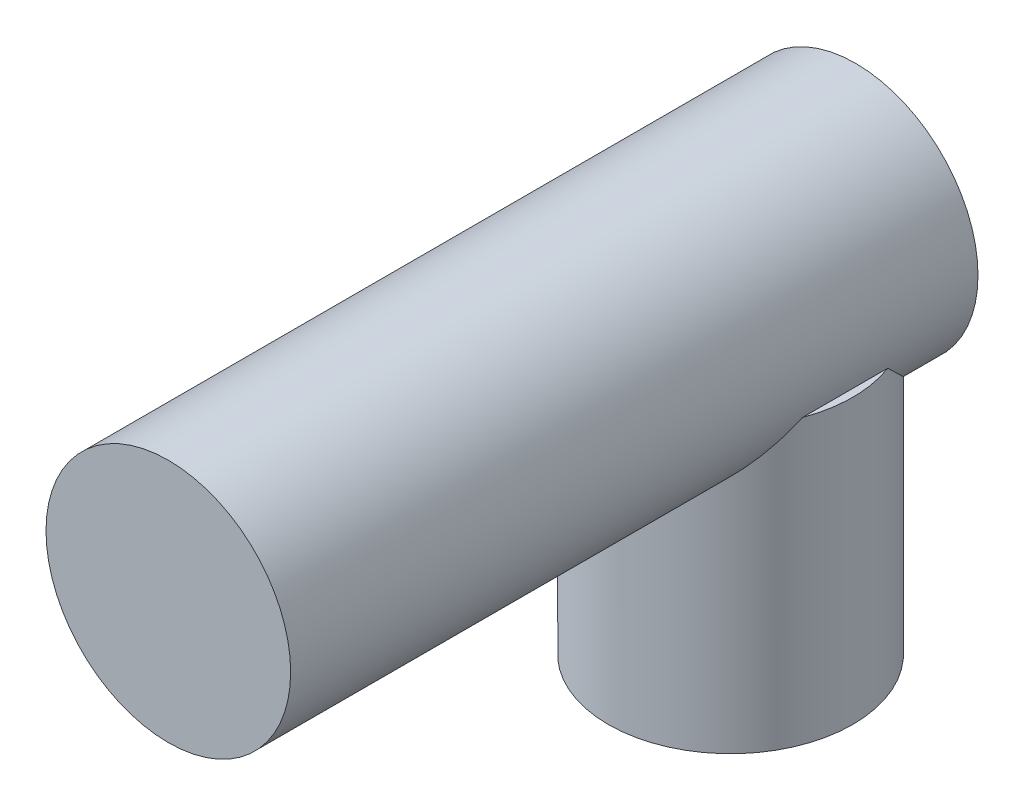
ISO-10303-21;
HEADER;
FILE_DESCRIPTION(('STEP AP214'),'2;1');
FILE_NAME('part.step','',(''),(''),'','','');
FILE_SCHEMA(('AUTOMOTIVE_DESIGN { 1 0 10303 214 1 1 1 1 }'));
ENDSEC;
DATA;
#1=APPLICATION_CONTEXT('core data for automotive mechanical design processes');
#2=APPLICATION_PROTOCOL_DEFINITION('international standard','automotive_design',2000,#1);
#3=PRODUCT_CONTEXT('',#1,'mechanical');
#4=PRODUCT('Part','Part','',(#3));
#5=PRODUCT_RELATED_PRODUCT_CATEGORY('part','',(#4));
#6=PRODUCT_DEFINITION_FORMATION('','',#4);
#7=PRODUCT_DEFINITION_CONTEXT('part definition',#1,'design');
#8=PRODUCT_DEFINITION('design','',#6,#7);
#9=PRODUCT_DEFINITION_SHAPE('','',#8);
#10=(LENGTH_UNIT() NAMED_UNIT(*) SI_UNIT(.MILLI.,.METRE.));
#11=(NAMED_UNIT(*) PLANE_ANGLE_UNIT() SI_UNIT($,.RADIAN.));
#12=(NAMED_UNIT(*) SI_UNIT($,.STERADIAN.) SOLID_ANGLE_UNIT());
#13=UNCERTAINTY_MEASURE_WITH_UNIT(LENGTH_MEASURE(1.E-05),#10,'distance_accuracy_value','');
#14=(GEOMETRIC_REPRESENTATION_CONTEXT(3) GLOBAL_UNCERTAINTY_ASSIGNED_CONTEXT((#13)) GLOBAL_UNIT_ASSIGNED_CONTEXT((#10,
#11,#12)) REPRESENTATION_CONTEXT('',''));
#15=CARTESIAN_POINT('',(0.,0.,0.));
#16=DIRECTION('',(0.,0.,1.));
#17=DIRECTION('',(1.,0.,0.));
#18=AXIS2_PLACEMENT_3D('',#15,#16,#17);
#19=CARTESIAN_POINT('',(-32.9797729407903,24.7348297055927,147.5));
#20=DIRECTION('',(0.,0.,-1.));
#21=DIRECTION('',(-1.,0.,0.));
#22=AXIS2_PLACEMENT_3D('',#19,#20,#21);
#23=CYLINDRICAL_SURFACE('',#22,26.25);
#24=CARTESIAN_POINT('',(-59.2297729407903,24.7348297055927,28.6223961676414));
#25=CARTESIAN_POINT('',(-59.2297710614949,24.6109071117966,28.6224394542431));
#26=CARTESIAN_POINT('',(-59.2288803778497,24.4867957997756,28.6353153548123));
#27=CARTESIAN_POINT('',(-59.2254512704913,24.2429523613952,28.6834059306615));
#28=CARTESIAN_POINT('',(-59.2229065636287,24.1232387803838,28.7187057762869));
#29=CARTESIAN_POINT('',(-59.2161185290023,23.878635950606,28.8089929353913));
#30=CARTESIAN_POINT('',(-59.2117354656518,23.7543548857848,28.865546202593));
#31=CARTESIAN_POINT('',(-59.201548793061,23.511823102974,28.9904486776536));
#32=CARTESIAN_POINT('',(-59.1957421142954,23.3935860916007,29.0588232788705));
#33=CARTESIAN_POINT('',(-59.1828059437338,23.1609040958134,29.2035623462346));
#34=CARTESIAN_POINT('',(-59.175665916845,23.0464985232042,29.2799881706555));
#35=CARTESIAN_POINT('',(-59.1601840930025,22.8213882775314,29.4376935174372));
#36=CARTESIAN_POINT('',(-59.1518435463561,22.7106798999324,29.5189679391856));
#37=CARTESIAN_POINT('',(-59.123087021267,22.3579815789262,29.7862119544369));
#38=CARTESIAN_POINT('',(-59.100381786924,22.1210876768216,29.9786162889379));
#39=CARTESIAN_POINT('',(-59.0494350111136,21.6542217791441,30.3709931923381));
#40=CARTESIAN_POINT('',(-59.0211904070849,21.4242536941633,30.5709698982113));
#41=CARTESIAN_POINT('',(-58.9591721659741,20.9683561277985,30.9753834839527));
#42=CARTESIAN_POINT('',(-58.9253896235688,20.7424338122045,31.179827080196));
#43=CARTESIAN_POINT('',(-58.8523512169473,20.2936811903591,31.5909825901599));
#44=CARTESIAN_POINT('',(-58.8130966767525,20.0708501504312,31.7976939440532));
#45=CARTESIAN_POINT('',(-58.6873425711288,19.406969913291,32.4185340896451));
#46=CARTESIAN_POINT('',(-58.5926717417058,18.9692163149835,32.8345619173358));
#47=CARTESIAN_POINT('',(-58.3814048838444,18.1001344942149,33.6671033137691));
#48=CARTESIAN_POINT('',(-58.2648239110513,17.6688020777674,34.083616354929));
#49=CARTESIAN_POINT('',(-58.0079793486902,16.8066532005889,34.9200543339275));
#50=CARTESIAN_POINT('',(-57.8674634408231,16.3758974477056,35.3399647581081));
#51=CARTESIAN_POINT('',(-57.5633481359967,15.5198076411113,36.1769612198532));
#52=CARTESIAN_POINT('',(-57.399746821273,15.0944740410365,36.5940470197493));
#53=CARTESIAN_POINT('',(-56.8734824717985,13.826509952237,37.8397998147372));
#54=CARTESIAN_POINT('',(-56.4754850365227,12.9923421974695,38.662546777481));
#55=CARTESIAN_POINT('',(-55.5815852835616,11.3522651600247,40.2831317225324));
#56=CARTESIAN_POINT('',(-55.0856590995985,10.5463628224242,41.0809635777596));
#57=CARTESIAN_POINT('',(-53.9915723143319,8.97141525949365,42.6417316302759));
#58=CARTESIAN_POINT('',(-53.3934810941316,8.20234547173683,43.4046910669025));
#59=CARTESIAN_POINT('',(-52.3233224392021,6.97830985925677,44.6196740767042));
#60=CARTESIAN_POINT('',(-51.8826174260319,6.50932513423202,45.0853648006298));
#61=CARTESIAN_POINT('',(-50.9557569388855,5.59454765726865,45.9939294285675));
#62=CARTESIAN_POINT('',(-50.4696041651942,5.14875352990397,46.4368046857415));
#63=CARTESIAN_POINT('',(-49.4517746528461,4.2853728540365,47.2946343779878));
#64=CARTESIAN_POINT('',(-48.9201756021038,3.86774026817096,47.7096343778756));
#65=CARTESIAN_POINT('',(-47.8101246003773,3.06475094290468,48.5075717082417));
#66=CARTESIAN_POINT('',(-47.2316661949845,2.67939866471419,48.8905046069728));
#67=CARTESIAN_POINT('',(-46.149703771025,2.02069872113871,49.5449990145007));
#68=CARTESIAN_POINT('',(-45.6545772423477,1.74042667737476,49.8234555267394));
#69=CARTESIAN_POINT('',(-44.6357711403118,1.20760281986506,50.352731040931));
#70=CARTESIAN_POINT('',(-44.1121075573578,0.955035716242634,50.6035652874356));
#71=CARTESIAN_POINT('',(-43.0373876741769,0.480926704789942,51.0742723305245));
#72=CARTESIAN_POINT('',(-42.4863296625247,0.259386738641464,51.2941431894214));
#73=CARTESIAN_POINT('',(-41.3591239810701,-0.14906589198764,51.6993063857579));
#74=CARTESIAN_POINT('',(-40.7829760411965,-0.335978183617742,51.8845983508724));
#75=CARTESIAN_POINT('',(-39.6032053758543,-0.673290882633637,52.218690912373));
#76=CARTESIAN_POINT('',(-38.9993708720855,-0.823320810719933,52.3671213792708));
#77=CARTESIAN_POINT('',(-37.7739866779729,-1.08124947741681,52.6218765909567));
#78=CARTESIAN_POINT('',(-37.1524368648286,-1.18914792390092,52.7282010437949));
#79=CARTESIAN_POINT('',(-35.8977620414991,-1.36015689946725,52.8960791612422));
#80=CARTESIAN_POINT('',(-35.264647691768,-1.42330673355128,52.9576721170064));
#81=CARTESIAN_POINT('',(-33.992745356416,-1.50335246761193,53.0346112266945));
#82=CARTESIAN_POINT('',(-33.3539583071842,-1.52025586413804,53.0499648760527));
#83=CARTESIAN_POINT('',(-32.1744183507574,-1.50840262753496,53.0352464495145));
#84=CARTESIAN_POINT('',(-31.6334968216357,-1.48618481863564,53.0117133249802));
#85=CARTESIAN_POINT('',(-30.5565578043573,-1.40865649057997,52.9315484760086));
#86=CARTESIAN_POINT('',(-30.0205397165165,-1.35335007456838,52.8749208554664));
#87=CARTESIAN_POINT('',(-28.9572141202892,-1.210677486306,52.7295944982487));
#88=CARTESIAN_POINT('',(-28.4299068375732,-1.12331048481956,52.6408949320446));
#89=CARTESIAN_POINT('',(-27.3874094777685,-0.918050084474314,52.4329521022068));
#90=CARTESIAN_POINT('',(-26.8722199658256,-0.800155264933458,52.3137074170888));
#91=CARTESIAN_POINT('',(-25.8612511499717,-0.53688730212643,52.0477276029633));
#92=CARTESIAN_POINT('',(-25.3653429714662,-0.391759332454111,51.9012378517873));
#93=CARTESIAN_POINT('',(-24.3905844805424,-0.0754689225578641,51.58219315802));
#94=CARTESIAN_POINT('',(-23.9117334703717,0.0956924512127329,51.4096392831424));
#95=CARTESIAN_POINT('',(-22.9726999781114,0.461902132395933,51.040605170704));
#96=CARTESIAN_POINT('',(-22.5125204019819,0.656954139227439,50.8441212276445));
#97=CARTESIAN_POINT('',(-21.6120618695651,1.06875943381139,50.4294029381939));
#98=CARTESIAN_POINT('',(-21.1717871726324,1.28551733470506,50.2111639682643));
#99=CARTESIAN_POINT('',(-20.1037594571709,1.84835195515201,49.6445750483804));
#100=CARTESIAN_POINT('',(-19.488441157205,2.20622958453328,49.2843878318847));
#101=CARTESIAN_POINT('',(-18.3047520878774,2.95872827637089,48.527092836712));
#102=CARTESIAN_POINT('',(-17.73639942467,3.35336338597503,48.1299709432561));
#103=CARTESIAN_POINT('',(-16.6456190791886,4.17455348974269,47.3035678180639));
#104=CARTESIAN_POINT('',(-16.1232975010748,4.60117824093433,46.8742163036091));
#105=CARTESIAN_POINT('',(-15.1254183495853,5.48056070512321,45.9890702236371));
#106=CARTESIAN_POINT('',(-14.6498605321213,5.93331828169797,45.533275796161));
#107=CARTESIAN_POINT('',(-13.5698522582423,7.03952745624623,44.4193328560356));
#108=CARTESIAN_POINT('',(-12.9863326446386,7.70309575704569,43.7508788390283));
#109=CARTESIAN_POINT('',(-11.9033603056016,9.06309013081198,42.3799264338305));
#110=CARTESIAN_POINT('',(-11.4039473173064,9.75953153722451,41.6774121542199));
#111=CARTESIAN_POINT('',(-10.4862819328247,11.1768958093311,40.2460188365637));
#112=CARTESIAN_POINT('',(-10.0679743530499,11.897801634402,39.5171581278885));
#113=CARTESIAN_POINT('',(-9.30912357621469,13.3576978033089,38.0382190526793));
#114=CARTESIAN_POINT('',(-8.96854678689451,14.0966801816981,37.2881500096805));
#115=CARTESIAN_POINT('',(-8.45553021996632,15.3575014283115,36.0034618104431));
#116=CARTESIAN_POINT('',(-8.26358731876993,15.8762632861399,35.4734878071792));
#117=CARTESIAN_POINT('',(-7.915071968342,16.9166659100335,34.4057944419393));
#118=CARTESIAN_POINT('',(-7.75846575453013,17.4383034358233,33.868083000387));
#119=CARTESIAN_POINT('',(-7.51185909195178,18.3613827712735,32.9081629931151));
#120=CARTESIAN_POINT('',(-7.41482274527536,18.7628980177208,32.4878083265662));
#121=CARTESIAN_POINT('',(-7.24105296925731,19.5629995862414,31.639952679024));
#122=CARTESIAN_POINT('',(-7.16432265335393,19.9615854500666,31.2124506128211));
#123=CARTESIAN_POINT('',(-7.05532611262823,20.6056164255167,30.5026727772129));
#124=CARTESIAN_POINT('',(-7.01703301431688,20.8540950860803,30.2240541484224));
#125=CARTESIAN_POINT('',(-6.94870239968207,21.3427606679893,29.6583885607381));
#126=CARTESIAN_POINT('',(-6.91866506376583,21.5829474080371,29.3713414178137));
#127=CARTESIAN_POINT('',(-6.87768544468676,21.9487203343868,28.9016208326497));
#128=CARTESIAN_POINT('',(-6.86396242221493,22.0809328934094,28.7243820789933));
#129=CARTESIAN_POINT('',(-6.83964648819248,22.3323393496381,28.3601891002548));
#130=CARTESIAN_POINT('',(-6.82905397297338,22.451531597231,28.1732336485299));
#131=CARTESIAN_POINT('',(-6.81485156428867,22.6220722131473,27.8587399441028));
#132=CARTESIAN_POINT('',(-6.81012246312327,22.6818931328998,27.7359669868647));
#133=CARTESIAN_POINT('',(-6.80227690941147,22.7844860751958,27.4834731169522));
#134=CARTESIAN_POINT('',(-6.79915541637485,22.8273112879429,27.3537753454907));
#135=CARTESIAN_POINT('',(-6.795284118171,22.8812770527392,27.1157169869481));
#136=CARTESIAN_POINT('',(-6.79417767251588,22.8971342517601,27.0084807102456));
#137=CARTESIAN_POINT('',(-6.79330345713349,22.9096255457371,26.7929501998401));
#138=CARTESIAN_POINT('',(-6.79353393410877,22.9062848177284,26.6846575376234));
#139=CARTESIAN_POINT('',(-6.79529588478753,22.8812421447554,26.4708628655078));
#140=CARTESIAN_POINT('',(-6.79682146219721,22.8596234171229,26.3653504389262));
#141=CARTESIAN_POINT('',(-6.80101772473557,22.8019299066075,26.1583240923293));
#142=CARTESIAN_POINT('',(-6.80369098613023,22.7658226124736,26.0568197325779));
#143=CARTESIAN_POINT('',(-6.81165192155852,22.6622011574131,25.8070789300747));
#144=CARTESIAN_POINT('',(-6.81757704685019,22.5880871583096,25.6616783489524));
#145=CARTESIAN_POINT('',(-6.83133607814418,22.4264963852658,25.3784680204592));
#146=CARTESIAN_POINT('',(-6.83917523713915,22.3389830882442,25.2406804651768));
#147=CARTESIAN_POINT('',(-6.85666019419975,22.1552797765962,24.9694155609251));
#148=CARTESIAN_POINT('',(-6.8663213583972,22.0590198642101,24.8359871141847));
#149=CARTESIAN_POINT('',(-6.88730249151848,21.861612181919,24.5732627544605));
#150=CARTESIAN_POINT('',(-6.89862023678809,21.7604710842207,24.4439615804339));
#151=CARTESIAN_POINT('',(-6.93872956949662,21.4207382914692,24.0208920947947));
#152=CARTESIAN_POINT('',(-6.9710275418804,21.1752560720169,23.7330209059163));
#153=CARTESIAN_POINT('',(-7.04406676144488,20.6770579584718,23.164658166207));
#154=CARTESIAN_POINT('',(-7.08481173902077,20.4243389110694,22.8841699377504));
#155=CARTESIAN_POINT('',(-7.17478128104948,19.9148838095974,22.3274737685248));
#156=CARTESIAN_POINT('',(-7.22401815558388,19.6581424228308,22.051272685074));
#157=CARTESIAN_POINT('',(-7.33093583130167,19.142968245985,21.5022166460717));
#158=CARTESIAN_POINT('',(-7.38861503329361,18.8845357850757,21.229361067382));
#159=CARTESIAN_POINT('',(-7.51225300963221,18.3678645961622,20.6871871254507));
#160=CARTESIAN_POINT('',(-7.57818251381529,18.1096282792738,20.4178598028366));
#161=CARTESIAN_POINT('',(-7.71853183984574,17.5931323670956,19.8814418374502));
#162=CARTESIAN_POINT('',(-7.79295198539048,17.3348727712937,19.6143512803692));
#163=CARTESIAN_POINT('',(-8.02896046746236,16.5610831785701,18.8164648882147));
#164=CARTESIAN_POINT('',(-8.20337065029729,16.0462320638835,18.2887305779909));
#165=CARTESIAN_POINT('',(-8.55198794020445,15.1147440704669,17.3370468969014));
#166=CARTESIAN_POINT('',(-8.72042337822573,14.6973305443429,16.9117333191961));
#167=CARTESIAN_POINT('',(-9.08096747263135,13.8667768759314,16.0670112167644));
#168=CARTESIAN_POINT('',(-9.27307769717564,13.4536370186879,15.6476030852527));
#169=CARTESIAN_POINT('',(-9.88590505397086,12.2217390772843,14.3985667056919));
#170=CARTESIAN_POINT('',(-10.3429965760534,11.410833146803,13.5784632294726));
#171=CARTESIAN_POINT('',(-11.1041257902833,10.2179081985969,12.3735483035759));
#172=CARTESIAN_POINT('',(-11.3704209661602,9.82416787317023,11.9761123440591));
#173=CARTESIAN_POINT('',(-11.9288343249978,9.04566136292211,11.1906941243593));
#174=CARTESIAN_POINT('',(-12.2209536455285,8.66089557437925,10.8027122815975));
#175=CARTESIAN_POINT('',(-13.1365809144277,7.52268411993222,9.6554040668585));
#176=CARTESIAN_POINT('',(-13.7999043466495,6.7844581256406,8.91184062551742));
#177=CARTESIAN_POINT('',(-14.9507877542905,5.645863620602,7.76542931469159));
#178=CARTESIAN_POINT('',(-15.4033973122798,5.22784614115355,7.34463976453986));
#179=CARTESIAN_POINT('',(-16.3494458144015,4.41529588958183,6.52680428092097));
#180=CARTESIAN_POINT('',(-16.8428808800204,4.02076089267976,6.1297560981312));
#181=CARTESIAN_POINT('',(-17.8703727724756,3.25980960665175,5.36398045692887));
#182=CARTESIAN_POINT('',(-18.4043689842549,2.89335294143958,4.99521233166069));
#183=CARTESIAN_POINT('',(-19.235943158746,2.3679533216037,4.46646110404615));
#184=CARTESIAN_POINT('',(-19.5182212041986,2.19687301334442,4.29428289182686));
#185=CARTESIAN_POINT('',(-20.0930012287737,1.86336169924222,3.95860903195618));
#186=CARTESIAN_POINT('',(-20.3855058258776,1.70093293543694,3.79511563499378));
#187=CARTESIAN_POINT('',(-21.1686928022538,1.28567258241983,3.37709109779976));
#188=CARTESIAN_POINT('',(-21.6677456360271,1.04061419096146,3.13035731183174));
#189=CARTESIAN_POINT('',(-22.6912230065568,0.578600468258427,2.66505477861691));
#190=CARTESIAN_POINT('',(-23.2156418895888,0.361638913918886,2.44647979460666));
#191=CARTESIAN_POINT('',(-24.2880247357468,-0.0410437967967456,2.04061821072534));
#192=CARTESIAN_POINT('',(-24.8359842159858,-0.226770868405669,1.85332568658148));
#193=CARTESIAN_POINT('',(-25.9528292131165,-0.563880870018925,1.51312074399685));
#194=CARTESIAN_POINT('',(-26.521714905298,-0.715263512258563,1.36020861362219));
#195=CARTESIAN_POINT('',(-27.6814545385818,-0.981840063701422,1.0905867406534));
#196=CARTESIAN_POINT('',(-28.2724485438002,-1.09673258745053,0.974178592802655));
#197=CARTESIAN_POINT('',(-29.4674019904821,-1.2861547893277,0.781742473957389));
#198=CARTESIAN_POINT('',(-30.0713614942226,-1.36068427353545,0.705714696966463));
#199=CARTESIAN_POINT('',(-31.286478774468,-1.46759418652357,0.595818436352644));
#200=CARTESIAN_POINT('',(-31.8976322470063,-1.49999864124864,0.561925921431108));
#201=CARTESIAN_POINT('',(-33.1215453907271,-1.52191943950647,0.537031079604034));
#202=CARTESIAN_POINT('',(-33.7343048683863,-1.51144073260609,0.546023802911752));
#203=CARTESIAN_POINT('',(-34.8762371035176,-1.45198520381367,0.602695260160742));
#204=CARTESIAN_POINT('',(-35.405950775528,-1.408173694838,0.645209288514083));
#205=CARTESIAN_POINT('',(-36.4582679754579,-1.28906097746897,0.761718141327922));
#206=CARTESIAN_POINT('',(-36.9808722507613,-1.21376310594746,0.835709629874465));
#207=CARTESIAN_POINT('',(-38.0155876202514,-1.03295966111216,1.01388588078384));
#208=CARTESIAN_POINT('',(-38.5276982015704,-0.927452615113649,1.11807211513102));
#209=CARTESIAN_POINT('',(-39.5384642562491,-0.687913520147074,1.35494913318824));
#210=CARTESIAN_POINT('',(-40.0371189730544,-0.553879871023963,1.48764151590987));
#211=CARTESIAN_POINT('',(-41.0296081008661,-0.255911903918914,1.78286911835946));
#212=CARTESIAN_POINT('',(-41.5230787132175,-0.091370144458286,1.94601115764856));
#213=CARTESIAN_POINT('',(-42.49133324564,0.263242476199015,2.29778764654485));
#214=CARTESIAN_POINT('',(-42.9661175006025,0.453312879609175,2.48642163902386));
#215=CARTESIAN_POINT('',(-43.8956616718553,0.856750982140802,2.88694024437149));
#216=CARTESIAN_POINT('',(-44.3504168051432,1.07012420415456,3.09883036912703));
#217=CARTESIAN_POINT('',(-45.2388552253944,1.51791789094775,3.54360019026507));
#218=CARTESIAN_POINT('',(-45.6725339373562,1.75234289420884,3.77648441273537));
#219=CARTESIAN_POINT('',(-46.7384626754734,2.36717543764347,4.38734388192136));
#220=CARTESIAN_POINT('',(-47.3565045715652,2.76002842567625,4.77771817616939));
#221=CARTESIAN_POINT('',(-48.5416183759574,3.58270663880384,5.59522029119962));
#222=CARTESIAN_POINT('',(-49.1086692794797,4.01254695874858,6.02236311756368));
#223=CARTESIAN_POINT('',(-50.1931933440606,4.90418510549827,6.90830900516928));
#224=CARTESIAN_POINT('',(-50.7105575103052,5.36604952750076,7.36717803614301));
#225=CARTESIAN_POINT('',(-51.6952849830062,6.31581472057672,8.31056072243771));
#226=CARTESIAN_POINT('',(-52.1626491180749,6.8037150599759,8.79507395257797));
#227=CARTESIAN_POINT('',(-53.2192546059835,7.99328058595374,9.97593312438313));
#228=CARTESIAN_POINT('',(-53.786262430463,8.70500698829713,10.6820981269823));
#229=CARTESIAN_POINT('',(-54.8311761907701,10.1614795904952,12.1258763419391));
#230=CARTESIAN_POINT('',(-55.3090391820667,10.9062414920977,12.8635045021778));
#231=CARTESIAN_POINT('',(-56.1792531614589,12.4218180138867,14.3621748245126));
#232=CARTESIAN_POINT('',(-56.57158641886,13.1926379978472,15.1232218041899));
#233=CARTESIAN_POINT('',(-57.2737138328799,14.7548345303311,16.661219993085));
#234=CARTESIAN_POINT('',(-57.5835472149737,15.5462011126064,17.4381634542417));
#235=CARTESIAN_POINT('',(-58.0183226875509,16.8355032431801,18.6961110067471));
#236=CARTESIAN_POINT('',(-58.1682794943996,17.3276972671126,19.1745376204017));
#237=CARTESIAN_POINT('',(-58.438395521561,18.3174074324898,20.1300967437156));
#238=CARTESIAN_POINT('',(-58.5586755437367,18.8148931010504,20.6072264099853));
#239=CARTESIAN_POINT('',(-58.7403581404908,19.676225387171,21.4222429737897));
#240=CARTESIAN_POINT('',(-58.8087700429512,20.0377353922398,21.7610455095546));
#241=CARTESIAN_POINT('',(-58.9007529850875,20.5875143414677,22.2667943582708));
#242=CARTESIAN_POINT('',(-58.9297598291348,20.7729764031594,22.4358101599792));
#243=CARTESIAN_POINT('',(-58.9840219140689,21.1463600946922,22.7713762196176));
#244=CARTESIAN_POINT('',(-59.0092806249224,21.3342792721291,22.9379286278488));
#245=CARTESIAN_POINT('',(-59.0563777469412,21.7164199996166,23.2695140366517));
#246=CARTESIAN_POINT('',(-59.0781649407927,21.9106925129149,23.4344955244554));
#247=CARTESIAN_POINT('',(-59.1179193496536,22.3059624677396,23.7584217861275));
#248=CARTESIAN_POINT('',(-59.1358721225603,22.5069821450753,23.9173419474835));
#249=CARTESIAN_POINT('',(-59.1674203137191,22.9151843869208,24.2197175424152));
#250=CARTESIAN_POINT('',(-59.1810857477223,23.122200147126,24.3633929701735));
#251=CARTESIAN_POINT('',(-59.2040009562825,23.5523431257911,24.6241456507725));
#252=CARTESIAN_POINT('',(-59.2132862830298,23.7753230871923,24.7414328666799));
#253=CARTESIAN_POINT('',(-59.221247302643,24.0637450127805,24.847320291013));
#254=CARTESIAN_POINT('',(-59.2225807216928,24.1179636951083,24.8653795569201));
#255=CARTESIAN_POINT('',(-59.2249291621035,24.2275805403742,24.897536404366));
#256=CARTESIAN_POINT('',(-59.2259440686087,24.2829791211118,24.9116325566149));
#257=CARTESIAN_POINT('',(-59.2284645539479,24.4502183018162,24.9468928791079));
#258=CARTESIAN_POINT('',(-59.2294615230644,24.5636520791797,24.961243339111));
#259=CARTESIAN_POINT('',(-59.2299602676859,24.7918588922218,24.9683783447413));
#260=CARTESIAN_POINT('',(-59.2294535126138,24.9066358754322,24.961039850598));
#261=CARTESIAN_POINT('',(-59.2269947135299,25.1333259220018,24.9262602218412));
#262=CARTESIAN_POINT('',(-59.2250371432916,25.2452263375613,24.898742226749));
#263=CARTESIAN_POINT('',(-59.2182279335566,25.5336980368843,24.8064567989002));
#264=CARTESIAN_POINT('',(-59.2123269630953,25.7060335530711,24.729126712562));
#265=CARTESIAN_POINT('',(-59.1978649702235,26.0395279663842,24.5533239687874));
#266=CARTESIAN_POINT('',(-59.1892907369121,26.2006263834522,24.4547470762574));
#267=CARTESIAN_POINT('',(-59.1678642546894,26.5464589871843,24.2255671206391));
#268=CARTESIAN_POINT('',(-59.1544999081769,26.7295019549652,24.092497287443));
#269=CARTESIAN_POINT('',(-59.1246269576396,27.088886643532,23.8178459013864));
#270=CARTESIAN_POINT('',(-59.1081156082774,27.2652223508104,23.6762569911292));
#271=CARTESIAN_POINT('',(-59.0719996699909,27.6138854531437,23.3878589503666));
#272=CARTESIAN_POINT('',(-59.0523883787819,27.786203212749,23.2410390555684));
#273=CARTESIAN_POINT('',(-59.0101336366545,28.1278241318063,22.9443495910306));
#274=CARTESIAN_POINT('',(-58.9874898714023,28.2971269766807,22.7944797065092));
#275=CARTESIAN_POINT('',(-58.9148860789111,28.8028543885912,22.3410895716764));
#276=CARTESIAN_POINT('',(-58.8603640861891,29.1360448728329,22.0346860804207));
#277=CARTESIAN_POINT('',(-58.7392668708905,29.7967860041704,21.4191228134587));
#278=CARTESIAN_POINT('',(-58.6727072406956,30.124343353758,21.1099670895747));
#279=CARTESIAN_POINT('',(-58.4950231774906,30.9208967792657,20.3523752654059));
#280=CARTESIAN_POINT('',(-58.3772615546428,31.3878289553399,19.9033063351475));
#281=CARTESIAN_POINT('',(-58.1159874252294,32.3154122653681,19.006067403194));
#282=CARTESIAN_POINT('',(-57.9724715535556,32.7760625700453,18.5578975267184));
#283=CARTESIAN_POINT('',(-57.6591305830402,33.6917387298466,17.663933945964));
#284=CARTESIAN_POINT('',(-57.4892768546215,34.1467578756401,17.2181433800631));
#285=CARTESIAN_POINT('',(-57.1229160828008,35.0502919982929,16.3309830741848));
#286=CARTESIAN_POINT('',(-56.9264102427735,35.4988072677984,15.8896131355765));
#287=CARTESIAN_POINT('',(-56.5066004995585,36.3878130252474,15.0134700055984));
#288=CARTESIAN_POINT('',(-56.2833503262739,36.8283176210871,14.5786855007192));
#289=CARTESIAN_POINT('',(-55.8091754304754,37.7012334068047,13.7162095240943));
#290=CARTESIAN_POINT('',(-55.5582495182754,38.1336442478243,13.2885183581772));
#291=CARTESIAN_POINT('',(-54.7633071964921,39.4165164991308,12.0187191039471));
#292=CARTESIAN_POINT('',(-54.17667113439,40.2535920290813,11.1889235340621));
#293=CARTESIAN_POINT('',(-53.1240616428596,41.5781472680527,9.87489596920651));
#294=CARTESIAN_POINT('',(-52.6938455038495,42.0803025722301,9.37648328553433));
#295=CARTESIAN_POINT('',(-51.7847750122421,43.0619077616923,8.40187694724127));
#296=CARTESIAN_POINT('',(-51.3059226017321,43.5413585524674,7.92568240653841));
#297=CARTESIAN_POINT('',(-50.2989077856742,44.4726090370713,7.00058285984814));
#298=CARTESIAN_POINT('',(-49.7707992455046,44.92443806237,6.55164890944649));
#299=CARTESIAN_POINT('',(-48.663996953239,45.7957742777703,5.68583388335074));
#300=CARTESIAN_POINT('',(-48.0853145317285,46.2152886682277,5.26894566726062));
#301=CARTESIAN_POINT('',(-47.0049524607594,46.9313041464129,4.55744730775655));
#302=CARTESIAN_POINT('',(-46.5128339298098,47.2350692254111,4.25561128580583));
#303=CARTESIAN_POINT('',(-45.4975092437984,47.8153532384276,3.67908612934123));
#304=CARTESIAN_POINT('',(-44.97430491678,48.091873772062,3.40439540103571));
#305=CARTESIAN_POINT('',(-43.8984065891454,48.6137554224052,2.88609412949815));
#306=CARTESIAN_POINT('',(-43.3457388931143,48.85914369332,2.64245650023839));
#307=CARTESIAN_POINT('',(-42.212503513224,49.3151468590519,2.18989490415228));
#308=CARTESIAN_POINT('',(-41.6319403335836,49.5257673435444,1.9809653572148));
#309=CARTESIAN_POINT('',(-40.5403296908613,49.8779221751466,1.63188227481365));
#310=CARTESIAN_POINT('',(-40.0329103331809,50.0251165925864,1.48607522276173));
#311=CARTESIAN_POINT('',(-39.002960572432,50.2899922107251,1.22395050573267));
#312=CARTESIAN_POINT('',(-38.4804317031834,50.4076763954631,1.10762985911292));
#313=CARTESIAN_POINT('',(-37.4235242523668,50.6115582665592,0.906457470498662));
#314=CARTESIAN_POINT('',(-36.8891510499035,50.6977699474983,0.821591741485756));
#315=CARTESIAN_POINT('',(-35.8119167435347,50.8372510999185,0.684791568304749));
#316=CARTESIAN_POINT('',(-35.2690555308777,50.8905201489713,0.632857546424537));
#317=CARTESIAN_POINT('',(-34.1773194112455,50.9632210565879,0.562825053983672));
#318=CARTESIAN_POINT('',(-33.6284317511082,50.982555770968,0.544823712016526));
#319=CARTESIAN_POINT('',(-32.530477148869,50.9867251092041,0.543320904837436));
#320=CARTESIAN_POINT('',(-31.9814102066577,50.9715597119885,0.559819460696917));
#321=CARTESIAN_POINT('',(-30.8873490939986,50.9070401424747,0.627010532294985));
#322=CARTESIAN_POINT('',(-30.342355380832,50.857682188136,0.67770683063131));
#323=CARTESIAN_POINT('',(-29.2605877885459,50.7257335831458,0.812342684897674));
#324=CARTESIAN_POINT('',(-28.7238138692639,50.6431430949246,0.896282078345877));
#325=CARTESIAN_POINT('',(-27.6837927093423,50.450260206082,1.09182403507938));
#326=CARTESIAN_POINT('',(-27.180070298943,50.3412327785031,1.20216096626175));
#327=CARTESIAN_POINT('',(-26.1863528798154,50.0957030028203,1.45033088716766));
#328=CARTESIAN_POINT('',(-25.6963570975928,49.9592022064004,1.58816232400954));
#329=CARTESIAN_POINT('',(-24.7322115186764,49.6606191707655,1.88943487609726));
#330=CARTESIAN_POINT('',(-24.2580650567243,49.4985315885629,2.05288134017639));
#331=CARTESIAN_POINT('',(-23.3273983948625,49.1508298845938,2.40333665256103));
#332=CARTESIAN_POINT('',(-22.8708818114098,48.9652109688851,2.59035030206643));
#333=CARTESIAN_POINT('',(-21.798250069367,48.4940949856078,3.06486627580392));
#334=CARTESIAN_POINT('',(-21.191175233119,48.1983072152922,3.36268075465262));
#335=CARTESIAN_POINT('',(-20.0162712121737,47.5702028697555,3.99495456439066));
#336=CARTESIAN_POINT('',(-19.448454676359,47.2378746098329,4.32942561699034));
#337=CARTESIAN_POINT('',(-18.3522434196067,46.5412566142947,5.03048391721198));
#338=CARTESIAN_POINT('',(-17.8239118613986,46.1769176152189,5.39712066545777));
#339=CARTESIAN_POINT('',(-16.8077820353206,45.4213032480518,6.15752715606809));
#340=CARTESIAN_POINT('',(-16.3199847737715,45.0300272116515,6.55129757162019));
#341=CARTESIAN_POINT('',(-15.2087629340852,44.0732522064894,7.51429912568968));
#342=CARTESIAN_POINT('',(-14.6031420334978,43.4974777661231,8.09391894971791));
#343=CARTESIAN_POINT('',(-13.4653567379914,42.3111214916699,9.2886528863071));
#344=CARTESIAN_POINT('',(-12.9332224794419,41.7005255216917,9.90378141497629));
#345=CARTESIAN_POINT('',(-11.9390940988308,40.4507738393527,11.1636138151249));
#346=CARTESIAN_POINT('',(-11.4772215682839,39.8115710400115,11.8083664983404));
#347=CARTESIAN_POINT('',(-10.6221159546219,38.5117211202992,13.1208497708057));
#348=CARTESIAN_POINT('',(-10.2288687169721,37.8510784554958,13.7885755875616));
#349=CARTESIAN_POINT('',(-9.57060319632967,36.6288743986594,15.0259884299889));
#350=CARTESIAN_POINT('',(-9.29516702677048,36.0698805142189,15.5927173308628));
#351=CARTESIAN_POINT('',(-8.78828348957785,34.9434436891509,16.7373288201627));
#352=CARTESIAN_POINT('',(-8.5568368300109,34.3760006126816,17.3152115879593));
#353=CARTESIAN_POINT('',(-8.13804847625805,33.23871962581,18.4778197725464));
#354=CARTESIAN_POINT('',(-7.95047031915572,32.6689122367348,19.0624897918432));
#355=CARTESIAN_POINT('',(-7.7003790917153,31.8131845594299,19.947057760054));
#356=CARTESIAN_POINT('',(-7.62223411085347,31.5278004359449,20.2431450091941));
#357=CARTESIAN_POINT('',(-7.47627170671164,30.9574113507398,20.8382082977293));
#358=CARTESIAN_POINT('',(-7.40845373266632,30.6724063696032,21.137184182161));
#359=CARTESIAN_POINT('',(-7.30872436908937,30.2202076110427,21.6156759390631));
#360=CARTESIAN_POINT('',(-7.27347308878041,30.0525122989936,21.7940300205618));
#361=CARTESIAN_POINT('',(-7.20653650056365,29.7179889782608,22.152301082578));
#362=CARTESIAN_POINT('',(-7.17485205414636,29.5511611883488,22.3322184294131));
#363=CARTESIAN_POINT('',(-7.11472745643215,29.2171313753137,22.6959532101118));
#364=CARTESIAN_POINT('',(-7.08632664319595,29.0499452690528,22.879791777244));
#365=CARTESIAN_POINT('',(-7.033204436651,28.7180793729545,23.2499379914627));
#366=CARTESIAN_POINT('',(-7.00847956659251,28.5533973488174,23.4362431216191));
#367=CARTESIAN_POINT('',(-6.96237685675908,28.2255830378554,23.815243016826));
#368=CARTESIAN_POINT('',(-6.94105071700706,28.0625047182037,24.0079907196595));
#369=CARTESIAN_POINT('',(-6.9021499207791,27.7424966789562,24.4002932696194));
#370=CARTESIAN_POINT('',(-6.88458989080853,27.5855927977021,24.5998712864489));
#371=CARTESIAN_POINT('',(-6.85376956199623,27.2875560508049,25.0051546168493));
#372=CARTESIAN_POINT('',(-6.84043730295212,27.1461894418647,25.2106840508091));
#373=CARTESIAN_POINT('',(-6.81813364872265,26.890529165735,25.637916262199));
#374=CARTESIAN_POINT('',(-6.8091260352293,26.7760149107459,25.8594661731295));
#375=CARTESIAN_POINT('',(-6.8014686715008,26.6737244274695,26.1460806706403));
#376=CARTESIAN_POINT('',(-6.80018629052767,26.6562880299866,26.2001607047967));
#377=CARTESIAN_POINT('',(-6.79793958762476,26.6254174639871,26.3094691477998));
#378=CARTESIAN_POINT('',(-6.79697538541069,26.6119848020715,26.3646979805961));
#379=CARTESIAN_POINT('',(-6.79460557227424,26.5787525509277,26.531343054142));
#380=CARTESIAN_POINT('',(-6.79370732701877,26.5658060372672,26.6442787468206));
#381=CARTESIAN_POINT('',(-6.79339068041882,26.5612709950894,26.8711212156756));
#382=CARTESIAN_POINT('',(-6.79397945965771,26.5697861006014,26.9850300465477));
#383=CARTESIAN_POINT('',(-6.79657533377522,26.6064583082988,27.2098891031074));
#384=CARTESIAN_POINT('',(-6.79858812093081,26.6346942359605,27.320825593943));
#385=CARTESIAN_POINT('',(-6.80659040986159,26.7428130787517,27.6517074173633));
#386=CARTESIAN_POINT('',(-6.81453602359985,26.8457848679766,27.8636373996643));
#387=CARTESIAN_POINT('',(-6.83436690686823,27.078831364568,28.2721983559113));
#388=CARTESIAN_POINT('',(-6.84628546240281,27.2091314920935,28.4686821207945));
#389=CARTESIAN_POINT('',(-6.87478702113773,27.4942686789062,28.8683951064417));
#390=CARTESIAN_POINT('',(-6.89167969964449,27.650249325726,29.0707850576133));
#391=CARTESIAN_POINT('',(-6.92940090834697,27.9700555080593,29.4689450494595));
#392=CARTESIAN_POINT('',(-6.95023235088288,28.1338867810144,29.6647100645398));
#393=CARTESIAN_POINT('',(-6.99579294589698,28.4662478250742,30.0523155131385));
#394=CARTESIAN_POINT('',(-7.02052854731526,28.6347849834424,30.2441488491943));
#395=CARTESIAN_POINT('',(-7.07384784385759,28.9745423463107,30.6248896725405));
#396=CARTESIAN_POINT('',(-7.10243185948725,29.1457627732295,30.8137969146757));
#397=CARTESIAN_POINT('',(-7.19387445248515,29.6614490541758,31.3769335550181));
#398=CARTESIAN_POINT('',(-7.26247701729242,30.0083350888571,31.7480274931977));
#399=CARTESIAN_POINT('',(-7.41498854425395,30.7040214047988,32.4845438269329));
#400=CARTESIAN_POINT('',(-7.49888353873017,31.0528196597995,32.8499710704761));
#401=CARTESIAN_POINT('',(-7.70495847693609,31.8375909425704,33.667088307814));
#402=CARTESIAN_POINT('',(-7.83147011883076,32.273652569522,34.1176096350625));
#403=CARTESIAN_POINT('',(-8.10895956581718,33.1439852406084,35.0129020741126));
#404=CARTESIAN_POINT('',(-8.25993999925671,33.5782560872396,35.4576725626321));
#405=CARTESIAN_POINT('',(-8.58689678020512,34.4438103057928,36.3417278933583));
#406=CARTESIAN_POINT('',(-8.76289506481107,34.875090703695,36.7810075491601));
#407=CARTESIAN_POINT('',(-9.14023955452347,35.7329540903413,37.6532031619411));
#408=CARTESIAN_POINT('',(-9.3415848689364,36.159537243574,38.0861193419358));
#409=CARTESIAN_POINT('',(-9.77008477315625,37.0066723778935,38.9447544728667));
#410=CARTESIAN_POINT('',(-9.9972315030383,37.4272261519869,39.3704755704946));
#411=CARTESIAN_POINT('',(-10.4779659989567,38.2612061611943,40.2139488993721));
#412=CARTESIAN_POINT('',(-10.7315546250462,38.6746321639592,40.6317008708934));
#413=CARTESIAN_POINT('',(-11.2656215384366,39.4927632012825,41.4578546975422));
#414=CARTESIAN_POINT('',(-11.5460820674404,39.8974737817532,41.8662625096605));
#415=CARTESIAN_POINT('',(-12.1346389514247,40.696950178324,42.6726561626325));
#416=CARTESIAN_POINT('',(-12.4427327651398,41.0917169046319,43.0706429575038));
#417=CARTESIAN_POINT('',(-13.1761124018754,41.9770081954039,43.9628425461197));
#418=CARTESIAN_POINT('',(-13.6103035193582,42.463958780533,44.4533660166427));
#419=CARTESIAN_POINT('',(-14.2970521872141,43.1773722191706,45.1718066500224));
#420=CARTESIAN_POINT('',(-14.5318721397309,43.4123353722346,45.4083901410914));
#421=CARTESIAN_POINT('',(-15.0136031328066,43.8761746520358,45.8753746205545));
#422=CARTESIAN_POINT('',(-15.2605182823928,44.1050486688259,46.105773466148));
#423=CARTESIAN_POINT('',(-16.018766836343,44.7808977535861,46.7860686629224));
#424=CARTESIAN_POINT('',(-16.5483408984335,45.2178706159159,47.2258397517123));
#425=CARTESIAN_POINT('',(-17.656574243552,46.0596041735601,48.0729212849612));
#426=CARTESIAN_POINT('',(-18.2352172708912,46.4643754512357,48.4802423934738));
#427=CARTESIAN_POINT('',(-19.3162313023671,47.1556196276596,49.1758890620678));
#428=CARTESIAN_POINT('',(-19.8094689795083,47.4491976718732,49.4713545436324));
#429=CARTESIAN_POINT('',(-20.8262269031153,48.0090757784635,50.0349147629795));
#430=CARTESIAN_POINT('',(-21.3497453210227,48.275377485287,50.3030111507977));
#431=CARTESIAN_POINT('',(-22.4253932844981,48.7768635506284,50.8080125791905));
#432=CARTESIAN_POINT('',(-22.9774989961529,49.0120732679387,51.0449430380799));
#433=CARTESIAN_POINT('',(-24.1085955235126,49.4478181671241,51.4840737111237));
#434=CARTESIAN_POINT('',(-24.6875821667202,49.6483587077237,51.6862792925799));
#435=CARTESIAN_POINT('',(-25.7781008463045,49.9830318425901,52.0239872610856));
#436=CARTESIAN_POINT('',(-26.2862625329863,50.122636362704,52.1649675008392));
#437=CARTESIAN_POINT('',(-27.3170222134674,50.3722404491074,52.4173007686495));
#438=CARTESIAN_POINT('',(-27.8396187666793,50.4822429579659,52.5286567414751));
#439=CARTESIAN_POINT('',(-28.8959250433632,50.6707579276973,52.7198623818));
#440=CARTESIAN_POINT('',(-29.42962980935,50.7492841320515,52.7997257996283));
#441=CARTESIAN_POINT('',(-30.5047488487401,50.8734898546661,52.9265961486773));
#442=CARTESIAN_POINT('',(-31.046163223321,50.9191689414495,52.9736026482921));
#443=CARTESIAN_POINT('',(-32.1340359716329,50.9768696485414,53.0339570508774));
#444=CARTESIAN_POINT('',(-32.6805036139484,50.9888062218762,53.0472198956104));
#445=CARTESIAN_POINT('',(-33.7728774455074,50.9785305361891,53.0395974277667));
#446=CARTESIAN_POINT('',(-34.3187836344685,50.9563182599974,53.0187120980206));
#447=CARTESIAN_POINT('',(-35.4058852796015,50.8781561384458,52.9432099292495));
#448=CARTESIAN_POINT('',(-35.9470800614467,50.8222015416603,52.8885883396261));
#449=CARTESIAN_POINT('',(-37.0207136648743,50.6775881994321,52.7466523957203));
#450=CARTESIAN_POINT('',(-37.5531524885384,50.5889294617649,52.6593380492108));
#451=CARTESIAN_POINT('',(-38.587668679062,50.3840499185661,52.4571182436566));
#452=CARTESIAN_POINT('',(-39.0901610539609,50.2688786942225,52.3432617805645));
#453=CARTESIAN_POINT('',(-40.0809649010928,50.0112535740458,52.0882884521654));
#454=CARTESIAN_POINT('',(-40.5692771040985,49.8688010870318,51.9471729945242));
#455=CARTESIAN_POINT('',(-41.5296604586288,49.5585407781616,51.6396162483381));
#456=CARTESIAN_POINT('',(-42.0017287173746,49.3907284685353,51.4731704772084));
#457=CARTESIAN_POINT('',(-42.9279348964389,49.0318127094453,51.1170251669229));
#458=CARTESIAN_POINT('',(-43.3820691102692,48.8407044783457,50.9273208537573));
#459=CARTESIAN_POINT('',(-44.4539980024937,48.3542941897861,50.4443517289114));
#460=CARTESIAN_POINT('',(-45.0623198882645,48.0484568305924,50.1405747013187));
#461=CARTESIAN_POINT('',(-46.2387282641358,47.4000918983554,49.4964531915398));
#462=CARTESIAN_POINT('',(-46.8068013641542,47.0575522094051,49.1560966338706));
#463=CARTESIAN_POINT('',(-47.902776791209,46.340294571259,48.4433694976347));
#464=CARTESIAN_POINT('',(-48.4306044224014,45.9655194095318,48.0709419971228));
#465=CARTESIAN_POINT('',(-49.4449131820021,45.1889183864906,47.2992450558388));
#466=CARTESIAN_POINT('',(-49.9313936481826,44.7870920921027,46.8999751853351));
#467=CARTESIAN_POINT('',(-51.0397642419406,43.804076070137,45.9233588901469));
#468=CARTESIAN_POINT('',(-51.6433909923817,43.21246830208,45.3357157655236));
#469=CARTESIAN_POINT('',(-52.7757319278037,41.9938800203687,44.1257961252211));
#470=CARTESIAN_POINT('',(-53.3044130055172,41.3668840439019,43.5035044715596));
#471=CARTESIAN_POINT('',(-54.2897479150176,40.084157931674,42.2312789833239));
#472=CARTESIAN_POINT('',(-54.7463560376678,39.4284098952983,41.5813279360392));
#473=CARTESIAN_POINT('',(-55.5897277148705,38.094286546114,40.2604894979445));
#474=CARTESIAN_POINT('',(-55.9765139849697,37.4159186777454,39.5896089998426));
#475=CARTESIAN_POINT('',(-56.7108520903625,35.9862407463093,38.1783111972336));
#476=CARTESIAN_POINT('',(-57.0529065211992,35.233396481537,37.4365816321698));
#477=CARTESIAN_POINT('',(-57.5087923802046,34.0920014409197,36.3163872313201));
#478=CARTESIAN_POINT('',(-57.6510309074399,33.7101650890594,35.9423556726046));
#479=CARTESIAN_POINT('',(-57.9170421540842,32.9421609098861,35.1921960241396));
#480=CARTESIAN_POINT('',(-58.0408164888486,32.5559934646644,34.8160681207807));
#481=CARTESIAN_POINT('',(-58.229299474317,31.9175774115657,34.1969842325391));
#482=CARTESIAN_POINT('',(-58.2993447193262,31.666615029334,33.9543070967703));
#483=CARTESIAN_POINT('',(-58.4319519835469,31.162659593035,33.4688901105538));
#484=CARTESIAN_POINT('',(-58.4945122909991,30.9096660885254,33.226150258435));
#485=CARTESIAN_POINT('',(-58.6126030774441,30.3995937917146,32.7394528575032));
#486=CARTESIAN_POINT('',(-58.6680792585714,30.1424986767823,32.4954992519631));
#487=CARTESIAN_POINT('',(-58.771456045943,29.6257377728469,32.0091897449445));
#488=CARTESIAN_POINT('',(-58.8193635548734,29.3660745583714,31.7668325831194));
#489=CARTESIAN_POINT('',(-58.9080502899984,28.8407383619608,31.2829004902434));
#490=CARTESIAN_POINT('',(-58.9487668662544,28.575033347658,31.0413488599102));
#491=CARTESIAN_POINT('',(-59.0226999452711,28.0367604578151,30.5627961215726));
#492=CARTESIAN_POINT('',(-59.0558898428433,27.7641719096869,30.3258137841518));
#493=CARTESIAN_POINT('',(-59.0996420177019,27.3490012321424,29.9806642529235));
#494=CARTESIAN_POINT('',(-59.1131533169247,27.2104648579289,29.8680204051316));
#495=CARTESIAN_POINT('',(-59.1382339157042,26.9296686421561,29.6472733013422));
#496=CARTESIAN_POINT('',(-59.1498037504199,26.7874098392129,29.5391688002673));
#497=CARTESIAN_POINT('',(-59.1708691955713,26.4983173012608,29.330819495778));
#498=CARTESIAN_POINT('',(-59.1803765402781,26.3515151852099,29.2305324263182));
#499=CARTESIAN_POINT('',(-59.1972314066985,26.050169007,29.0423583598534));
#500=CARTESIAN_POINT('',(-59.2045837466087,25.8956431341022,28.9544439324283));
#501=CARTESIAN_POINT('',(-59.2151998260657,25.6173545135881,28.8211487381753));
#502=CARTESIAN_POINT('',(-59.2190300548774,25.4961327436127,28.7706585040402));
#503=CARTESIAN_POINT('',(-59.2250542531749,25.247586572349,28.6892213901808));
#504=CARTESIAN_POINT('',(-59.2272585430716,25.1203062184034,28.658151438713));
#505=CARTESIAN_POINT('',(-59.2289353623388,24.9488239586973,28.6343603323382));
#506=CARTESIAN_POINT('',(-59.2292484699302,24.9061721553946,28.6298956781783));
#507=CARTESIAN_POINT('',(-59.2296676654075,24.8206311192239,28.6239049532448));
#508=CARTESIAN_POINT('',(-59.2297735915543,24.7777417270499,28.6223811783201));
#509=CARTESIAN_POINT('',(-59.2297729407903,24.7348297055927,28.6223961676414));
#510=B_SPLINE_CURVE_WITH_KNOTS('',3,(#24,#25,#26,#27,#28,#29,#30,#31,#32,#33,#34,#35,#36,#37,
#38,#39,#40,#41,#42,#43,#44,#45,#46,#47,#48,#49,#50,#51,#52,#53,#54,#55,#56,#57,#58,#59,#60,#61,
#62,#63,#64,#65,#66,#67,#68,#69,#70,#71,#72,#73,#74,#75,#76,#77,#78,#79,#80,#81,#82,#83,#84,#85,
#86,#87,#88,#89,#90,#91,#92,#93,#94,#95,#96,#97,#98,#99,#100,#101,#102,#103,#104,#105,#106,#107,
#108,#109,#110,#111,#112,#113,#114,#115,#116,#117,#118,#119,#120,#121,#122,#123,#124,#125,#126,
#127,#128,#129,#130,#131,#132,#133,#134,#135,#136,#137,#138,#139,#140,#141,#142,#143,#144,#145,
#146,#147,#148,#149,#150,#151,#152,#153,#154,#155,#156,#157,#158,#159,#160,#161,#162,#163,#164,
#165,#166,#167,#168,#169,#170,#171,#172,#173,#174,#175,#176,#177,#178,#179,#180,#181,#182,#183,
#184,#185,#186,#187,#188,#189,#190,#191,#192,#193,#194,#195,#196,#197,#198,#199,#200,#201,#202,
#203,#204,#205,#206,#207,#208,#209,#210,#211,#212,#213,#214,#215,#216,#217,#218,#219,#220,#221,
#222,#223,#224,#225,#226,#227,#228,#229,#230,#231,#232,#233,#234,#235,#236,#237,#238,#239,#240,
#241,#242,#243,#244,#245,#246,#247,#248,#249,#250,#251,#252,#253,#254,#255,#256,#257,#258,#259,
#260,#261,#262,#263,#264,#265,#266,#267,#268,#269,#270,#271,#272,#273,#274,#275,#276,#277,#278,
#279,#280,#281,#282,#283,#284,#285,#286,#287,#288,#289,#290,#291,#292,#293,#294,#295,#296,#297,
#298,#299,#300,#301,#302,#303,#304,#305,#306,#307,#308,#309,#310,#311,#312,#313,#314,#315,#316,
#317,#318,#319,#320,#321,#322,#323,#324,#325,#326,#327,#328,#329,#330,#331,#332,#333,#334,#335,
#336,#337,#338,#339,#340,#341,#342,#343,#344,#345,#346,#347,#348,#349,#350,#351,#352,#353,#354,
#355,#356,#357,#358,#359,#360,#361,#362,#363,#364,#365,#366,#367,#368,#369,#370,#371,#372,#373,
#374,#375,#376,#377,#378,#379,#380,#381,#382,#383,#384,#385,#386,#387,#388,#389,#390,#391,#392,
#393,#394,#395,#396,#397,#398,#399,#400,#401,#402,#403,#404,#405,#406,#407,#408,#409,#410,#411,
#412,#413,#414,#415,#416,#417,#418,#419,#420,#421,#422,#423,#424,#425,#426,#427,#428,#429,#430,
#431,#432,#433,#434,#435,#436,#437,#438,#439,#440,#441,#442,#443,#444,#445,#446,#447,#448,#449,
#450,#451,#452,#453,#454,#455,#456,#457,#458,#459,#460,#461,#462,#463,#464,#465,#466,#467,#468,
#469,#470,#471,#472,#473,#474,#475,#476,#477,#478,#479,#480,#481,#482,#483,#484,#485,#486,#487,
#488,#489,#490,#491,#492,#493,#494,#495,#496,#497,#498,#499,#500,#501,#502,#503,#504,#505,#506,
#507,#508,#509),.UNSPECIFIED.,.T.,.F.,(4,2,2,2,2,2,2,2,2,2,2,2,2,2,2,2,2,2,2,2,2,2,2,2,2,2,2,2,
2,2,2,2,2,2,2,2,2,2,2,2,2,2,2,2,2,2,2,2,2,2,2,2,2,2,2,2,2,2,2,2,2,2,2,2,2,2,2,2,2,2,2,2,2,2,2,2,
2,2,2,2,2,2,2,2,2,2,2,2,2,2,2,2,2,2,2,2,2,2,2,2,2,2,2,2,2,2,2,2,2,2,2,2,2,2,2,2,2,2,2,2,2,2,2,2,
2,2,2,2,2,2,2,2,2,2,2,2,2,2,2,2,2,2,2,2,2,2,2,2,2,2,2,2,2,2,2,2,2,2,2,2,2,2,2,2,2,2,2,2,2,2,2,2,
2,2,2,2,2,2,2,2,2,2,2,2,2,2,2,2,2,2,2,2,2,2,2,2,2,2,2,2,2,2,2,2,2,2,2,2,2,2,2,2,2,2,2,2,2,2,2,2,
2,2,2,2,2,2,2,2,2,2,2,2,2,2,2,2,2,2,2,2,2,2,4),(0.,0.37157093473633,0.744561673357337,
1.15339651985361,1.56312074919177,1.97623091471048,2.38891390967568,3.30649646563897,
4.22458776455508,5.1441701560487,6.06353042752708,7.89689576360774,9.72900587103545,
11.5817832211676,13.4347145770118,17.1423970496255,20.8509842415973,24.5570628425324,
26.9385117086203,29.3198191704164,31.6971343409192,34.0747775214696,35.9734145162418,
37.8709983576753,39.7687008971098,41.6664238687067,43.58249457786,45.4985785722101,
47.412977478521,49.3270660422969,50.9507309964651,52.574194650172,54.1977002971492,
55.8212815112689,57.430892195554,59.0404369602009,60.6502312756228,62.260368448767,
64.6500631122795,67.0406747921473,69.4366602036882,71.8326331084776,75.1517110595301,
78.4723527742617,81.7907271560543,85.107664737038,87.4050181799113,89.7001670928041,
91.4678738251812,93.235851435769,94.3615956246007,95.4873644115515,96.1517805010747,
96.8162806716515,97.2255038872302,97.633436092134,97.9571323959448,98.2804042866489,
98.6022122396911,98.9247463801815,99.41328173162,99.9031732252795,100.397397720556,
100.890964793302,102.029558803955,103.168656719617,104.309419998566,105.449967466938,
106.586577534532,107.723230948756,109.995175613514,111.852498209829,113.70994389684,
117.426293583948,119.284510589904,121.142809492332,124.855383153102,127.092133353786,
129.328671301713,131.56193032094,132.678484870898,133.795327380733,135.618304250427,
137.440876660655,139.263103519768,141.08534564637,142.922268907449,144.759200993767,
146.595084928415,148.430756971642,150.028527914531,151.626129571236,153.223809123622,
154.821578318968,156.455466841556,158.089326068727,159.723573373068,161.358173848925,
163.844050028494,166.330945571354,168.823177491439,171.315368103265,174.765806928909,
178.217903696675,181.670715420383,185.12188252336,187.229092622492,189.327578129879,
190.827778833306,191.585524678683,192.342564577785,193.109905635723,193.880087766461,
194.636944385616,195.387547345391,195.558885348272,195.730285064865,196.071332742564,
196.414318864332,196.758618195437,197.322348383674,197.888909829851,198.56842772622,
199.248541146605,199.930145654404,200.611820869252,201.97933190635,203.345084126878,
205.319863737394,207.294901565178,209.272101531524,211.249212254637,213.222415514466,
215.195703628696,219.137967065126,221.6204367287,224.102807304105,226.582494352824,
229.061627269043,231.016993821243,232.97224549899,234.925779866372,236.878999854217,
238.521591922639,240.164017827099,241.805712517412,243.447428258979,245.093836138717,
246.740245024029,248.386836047793,250.033419023636,251.612952836464,253.192397462929,
254.772172343596,256.352269584099,258.563151658073,260.774742782309,262.989799173436,
265.204910540019,268.251337070561,271.299009233207,274.351896975419,277.404154288101,
279.929878763777,282.455643890721,284.967463403348,286.223128386754,287.478726378908,
288.220705004196,288.962862455389,289.713149166058,290.462721669644,291.222787357752,
291.985753514201,292.734933320203,293.477724397527,293.648078871865,293.818497369698,
294.157554186022,294.498251376078,294.840318208126,295.542015924298,296.24974687955,
297.01744977319,297.785722545547,298.555277904219,299.324897393089,300.862334543953,
302.398374415736,304.31674754195,306.235326869509,308.155599016499,310.075803704035,
311.995424997552,313.915108748456,315.833532513295,317.751780032887,320.198384521114,
321.421622812057,322.645279587943,325.088645413781,327.531204934065,329.466254711805,
331.401187759734,333.334532798543,335.267578737539,336.902463514987,338.537185717674,
340.171193372976,341.805222492073,343.443366475153,345.081511281878,346.719886817882,
348.358261964353,349.940445900943,351.522548154727,353.104930711877,354.687638611738,
356.921023912207,359.155148766449,361.393324035828,363.631535145692,366.715192088307,
369.800207020253,372.887170694939,375.973128252772,379.302382598549,380.961457384132,
382.62038693893,383.688502239093,384.756861345609,385.832971881526,386.908095259359,
387.992167238595,389.080013437179,389.61713719052,390.154112643148,390.687947895037,
391.220580321609,391.613730522368,392.00436326454,392.132930836685,392.261598736831),.UNSPECIFIED.);
#511=CARTESIAN_POINT('',(-57.5199830645476,15.416,36.2790592544215));
#512=VERTEX_POINT('',#511);
#513=CARTESIAN_POINT('',(-8.43956281703293,15.416,35.9432335809484));
#514=VERTEX_POINT('',#513);
#515=EDGE_CURVE('E42',#512,#514,#510,.T.);
#516=ORIENTED_EDGE('',*,*,#515,.T.);
#517=DIRECTION('',(0.,0.,-1.));
#518=VECTOR('',#517,1.);
#519=CARTESIAN_POINT('',(-8.43956281703293,15.416,147.5));
#520=LINE('',#519,#518);
#521=CARTESIAN_POINT('',(-8.43956281703293,15.416,17.6448618545986));
#522=VERTEX_POINT('',#521);
#523=EDGE_CURVE('E11',#514,#522,#520,.T.);
#524=ORIENTED_EDGE('',*,*,#523,.T.);
#525=CARTESIAN_POINT('',(-57.5199830645476,15.416,17.3090361811255));
#526=VERTEX_POINT('',#525);
#527=EDGE_CURVE('E68',#522,#526,#510,.T.);
#528=ORIENTED_EDGE('',*,*,#527,.T.);
#529=DIRECTION('',(0.,0.,-1.));
#530=VECTOR('',#529,1.);
#531=CARTESIAN_POINT('',(-57.5199830645476,15.416,147.5));
#532=LINE('',#531,#530);
#533=EDGE_CURVE('E52',#526,#512,#532,.F.);
#534=ORIENTED_EDGE('',*,*,#533,.T.);
#535=EDGE_LOOP('',(#516,#524,#528,#534));
#536=FACE_BOUND('',#535,.T.);
#537=CARTESIAN_POINT('',(-32.9797729407903,24.7348297055927,147.5));
#538=DIRECTION('',(0.,0.,1.));
#539=DIRECTION('',(1.,0.,0.));
#540=AXIS2_PLACEMENT_3D('',#537,#538,#539);
#541=CIRCLE('',#540,26.25);
#542=CARTESIAN_POINT('',(-6.72977294079028,24.7348297055927,147.5));
#543=VERTEX_POINT('',#542);
#544=EDGE_CURVE('E142',#543,#543,#541,.T.);
#545=ORIENTED_EDGE('',*,*,#544,.F.);
#546=EDGE_LOOP('',(#545));
#547=FACE_BOUND('',#546,.T.);
#548=CARTESIAN_POINT('',(-32.9797729407903,24.7348297055927,0.));
#549=DIRECTION('',(0.,0.,1.));
#550=DIRECTION('',(1.,0.,0.));
#551=AXIS2_PLACEMENT_3D('',#548,#549,#550);
#552=CIRCLE('',#551,26.25);
#553=CARTESIAN_POINT('',(-6.72977294079028,24.7348297055927,0.));
#554=VERTEX_POINT('',#553);
#555=EDGE_CURVE('E139',#554,#554,#552,.T.);
#556=ORIENTED_EDGE('',*,*,#555,.T.);
#557=EDGE_LOOP('',(#556));
#558=FACE_BOUND('',#557,.T.);
#559=ADVANCED_FACE('F34',(#536,#547,#558),#23,.T.);
#560=CARTESIAN_POINT('',(-32.9797729407903,24.7348297055927,147.5));
#561=DIRECTION('',(0.,0.,1.));
#562=DIRECTION('',(1.,0.,0.));
#563=AXIS2_PLACEMENT_3D('',#560,#561,#562);
#564=PLANE('',#563);
#565=ORIENTED_EDGE('',*,*,#544,.T.);
#566=EDGE_LOOP('',(#565));
#567=FACE_BOUND('',#566,.T.);
#568=ADVANCED_FACE('F85',(#567),#564,.T.);
#569=CARTESIAN_POINT('',(-32.9797729407903,24.7348297055927,0.));
#570=DIRECTION('',(0.,0.,1.));
#571=DIRECTION('',(1.,0.,0.));
#572=AXIS2_PLACEMENT_3D('',#569,#570,#571);
#573=PLANE('',#572);
#574=ORIENTED_EDGE('',*,*,#555,.F.);
#575=EDGE_LOOP('',(#574));
#576=FACE_BOUND('',#575,.T.);
#577=ADVANCED_FACE('F81',(#576),#573,.F.);
#578=CARTESIAN_POINT('',(-33.0435238404349,-45.4,26.7940477177735));
#579=DIRECTION('',(0.,1.,0.));
#580=DIRECTION('',(0.,0.,1.));
#581=AXIS2_PLACEMENT_3D('',#578,#579,#580);
#582=CYLINDRICAL_SURFACE('',#581,26.25);
#583=CARTESIAN_POINT('',(-33.0435238404349,-45.4,26.7940477177735));
#584=DIRECTION('',(0.,1.,0.));
#585=DIRECTION('',(0.,0.,1.));
#586=AXIS2_PLACEMENT_3D('',#583,#584,#585);
#587=CIRCLE('',#586,26.25);
#588=CARTESIAN_POINT('',(-33.0435238404349,-45.4,53.0440477177735));
#589=VERTEX_POINT('',#588);
#590=EDGE_CURVE('E69',#589,#589,#587,.T.);
#591=ORIENTED_EDGE('',*,*,#590,.T.);
#592=EDGE_LOOP('',(#591));
#593=FACE_BOUND('',#592,.T.);
#594=ORIENTED_EDGE('',*,*,#515,.F.);
#595=CARTESIAN_POINT('',(-33.0435238404349,15.416,26.7940477177735));
#596=DIRECTION('',(0.,1.,0.));
#597=DIRECTION('',(0.,0.,1.));
#598=AXIS2_PLACEMENT_3D('',#595,#596,#597);
#599=CIRCLE('',#598,26.25);
#600=EDGE_CURVE('E48',#526,#512,#599,.T.);
#601=ORIENTED_EDGE('',*,*,#600,.F.);
#602=ORIENTED_EDGE('',*,*,#527,.F.);
#603=EDGE_CURVE('E62',#514,#522,#599,.T.);
#604=ORIENTED_EDGE('',*,*,#603,.F.);
#605=EDGE_LOOP('',(#594,#601,#602,#604));
#606=FACE_BOUND('',#605,.T.);
#607=ADVANCED_FACE('F67',(#593,#606),#582,.T.);
#608=CARTESIAN_POINT('',(-33.0435238404349,15.416,26.7940477177735));
#609=DIRECTION('',(0.,1.,0.));
#610=DIRECTION('',(0.,0.,1.));
#611=AXIS2_PLACEMENT_3D('',#608,#609,#610);
#612=PLANE('',#611);
#613=ORIENTED_EDGE('',*,*,#523,.F.);
#614=ORIENTED_EDGE('',*,*,#603,.T.);
#615=EDGE_LOOP('',(#613,#614));
#616=FACE_BOUND('',#615,.T.);
#617=ADVANCED_FACE('F61',(#616),#612,.T.);
#618=ORIENTED_EDGE('',*,*,#533,.F.);
#619=ORIENTED_EDGE('',*,*,#600,.T.);
#620=EDGE_LOOP('',(#618,#619));
#621=FACE_BOUND('',#620,.T.);
#622=ADVANCED_FACE('F119',(#621),#612,.T.);
#623=CARTESIAN_POINT('',(-33.0435238404349,-45.4,26.7940477177735));
#624=DIRECTION('',(0.,1.,0.));
#625=DIRECTION('',(0.,0.,1.));
#626=AXIS2_PLACEMENT_3D('',#623,#624,#625);
#627=PLANE('',#626);
#628=ORIENTED_EDGE('',*,*,#590,.F.);
#629=EDGE_LOOP('',(#628));
#630=FACE_BOUND('',#629,.T.);
#631=ADVANCED_FACE('F83',(#630),#627,.F.);
#632=CLOSED_SHELL('',(#559,#568,#577,#607,#617,#622,#631));
#633=MANIFOLD_SOLID_BREP('B2',#632);
#634=ADVANCED_BREP_SHAPE_REPRESENTATION('',(#18,#633),#14);
#635=SHAPE_DEFINITION_REPRESENTATION(#9,#634);
ENDSEC;
END-ISO-10303-21;
